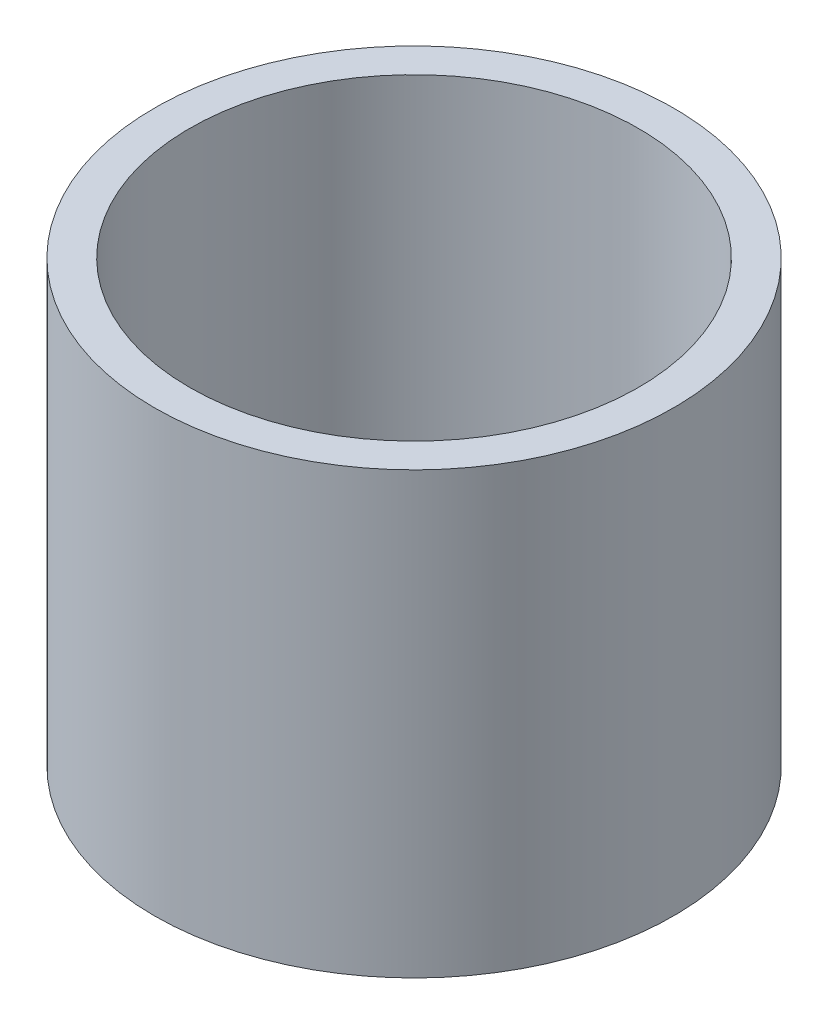
ISO-10303-21;
HEADER;
FILE_DESCRIPTION(('STEP AP214'),'2;1');
FILE_NAME('part.step','',(''),(''),'','','');
FILE_SCHEMA(('AUTOMOTIVE_DESIGN { 1 0 10303 214 1 1 1 1 }'));
ENDSEC;
DATA;
#1=APPLICATION_CONTEXT('core data for automotive mechanical design processes');
#2=APPLICATION_PROTOCOL_DEFINITION('international standard','automotive_design',2000,#1);
#3=PRODUCT_CONTEXT('',#1,'mechanical');
#4=PRODUCT('Part','Part','',(#3));
#5=PRODUCT_RELATED_PRODUCT_CATEGORY('part','',(#4));
#6=PRODUCT_DEFINITION_FORMATION('','',#4);
#7=PRODUCT_DEFINITION_CONTEXT('part definition',#1,'design');
#8=PRODUCT_DEFINITION('design','',#6,#7);
#9=PRODUCT_DEFINITION_SHAPE('','',#8);
#10=(LENGTH_UNIT() NAMED_UNIT(*) SI_UNIT(.MILLI.,.METRE.));
#11=(NAMED_UNIT(*) PLANE_ANGLE_UNIT() SI_UNIT($,.RADIAN.));
#12=(NAMED_UNIT(*) SI_UNIT($,.STERADIAN.) SOLID_ANGLE_UNIT());
#13=UNCERTAINTY_MEASURE_WITH_UNIT(LENGTH_MEASURE(1.E-05),#10,'distance_accuracy_value','');
#14=(GEOMETRIC_REPRESENTATION_CONTEXT(3) GLOBAL_UNCERTAINTY_ASSIGNED_CONTEXT((#13)) GLOBAL_UNIT_ASSIGNED_CONTEXT((#10,
#11,#12)) REPRESENTATION_CONTEXT('',''));
#15=CARTESIAN_POINT('',(0.,0.,0.));
#16=DIRECTION('',(0.,0.,1.));
#17=DIRECTION('',(1.,0.,0.));
#18=AXIS2_PLACEMENT_3D('',#15,#16,#17);
#19=CARTESIAN_POINT('',(0.,10.,0.));
#20=DIRECTION('',(0.,1.,0.));
#21=DIRECTION('',(0.,0.,1.));
#22=AXIS2_PLACEMENT_3D('',#19,#20,#21);
#23=PLANE('',#22);
#24=CARTESIAN_POINT('',(0.,10.,0.));
#25=DIRECTION('',(0.,1.,0.));
#26=DIRECTION('',(0.,0.,1.));
#27=AXIS2_PLACEMENT_3D('',#24,#25,#26);
#28=CIRCLE('',#27,5.9);
#29=CARTESIAN_POINT('',(0.,10.,5.9));
#30=VERTEX_POINT('',#29);
#31=EDGE_CURVE('E10',#30,#30,#28,.T.);
#32=ORIENTED_EDGE('',*,*,#31,.T.);
#33=EDGE_LOOP('',(#32));
#34=FACE_BOUND('',#33,.T.);
#35=CARTESIAN_POINT('',(0.,10.,0.));
#36=DIRECTION('',(0.,1.,0.));
#37=DIRECTION('',(0.,0.,1.));
#38=AXIS2_PLACEMENT_3D('',#35,#36,#37);
#39=CIRCLE('',#38,5.1);
#40=CARTESIAN_POINT('',(0.,10.,5.1));
#41=VERTEX_POINT('',#40);
#42=EDGE_CURVE('E54',#41,#41,#39,.T.);
#43=ORIENTED_EDGE('',*,*,#42,.F.);
#44=EDGE_LOOP('',(#43));
#45=FACE_BOUND('',#44,.T.);
#46=ADVANCED_FACE('F41',(#34,#45),#23,.T.);
#47=CARTESIAN_POINT('',(0.,0.,0.));
#48=DIRECTION('',(0.,1.,0.));
#49=DIRECTION('',(0.,0.,1.));
#50=AXIS2_PLACEMENT_3D('',#47,#48,#49);
#51=PLANE('',#50);
#52=CARTESIAN_POINT('',(0.,0.,0.));
#53=DIRECTION('',(0.,1.,0.));
#54=DIRECTION('',(0.,0.,1.));
#55=AXIS2_PLACEMENT_3D('',#52,#53,#54);
#56=CIRCLE('',#55,5.9);
#57=CARTESIAN_POINT('',(0.,0.,5.9));
#58=VERTEX_POINT('',#57);
#59=EDGE_CURVE('E45',#58,#58,#56,.T.);
#60=ORIENTED_EDGE('',*,*,#59,.F.);
#61=EDGE_LOOP('',(#60));
#62=FACE_BOUND('',#61,.T.);
#63=CARTESIAN_POINT('',(0.,0.,0.));
#64=DIRECTION('',(0.,1.,0.));
#65=DIRECTION('',(0.,0.,1.));
#66=AXIS2_PLACEMENT_3D('',#63,#64,#65);
#67=CIRCLE('',#66,5.1);
#68=CARTESIAN_POINT('',(0.,0.,5.1));
#69=VERTEX_POINT('',#68);
#70=EDGE_CURVE('E56',#69,#69,#67,.T.);
#71=ORIENTED_EDGE('',*,*,#70,.T.);
#72=EDGE_LOOP('',(#71));
#73=FACE_BOUND('',#72,.T.);
#74=ADVANCED_FACE('F68',(#62,#73),#51,.F.);
#75=CARTESIAN_POINT('',(0.,10.,0.));
#76=DIRECTION('',(0.,-1.,0.));
#77=DIRECTION('',(0.,0.,-1.));
#78=AXIS2_PLACEMENT_3D('',#75,#76,#77);
#79=CYLINDRICAL_SURFACE('',#78,5.9);
#80=ORIENTED_EDGE('',*,*,#31,.F.);
#81=EDGE_LOOP('',(#80));
#82=FACE_BOUND('',#81,.T.);
#83=ORIENTED_EDGE('',*,*,#59,.T.);
#84=EDGE_LOOP('',(#83));
#85=FACE_BOUND('',#84,.T.);
#86=ADVANCED_FACE('F43',(#82,#85),#79,.T.);
#87=CARTESIAN_POINT('',(0.,10.,0.));
#88=DIRECTION('',(0.,-1.,0.));
#89=DIRECTION('',(0.,0.,-1.));
#90=AXIS2_PLACEMENT_3D('',#87,#88,#89);
#91=CYLINDRICAL_SURFACE('',#90,5.1);
#92=ORIENTED_EDGE('',*,*,#42,.T.);
#93=EDGE_LOOP('',(#92));
#94=FACE_BOUND('',#93,.T.);
#95=ORIENTED_EDGE('',*,*,#70,.F.);
#96=EDGE_LOOP('',(#95));
#97=FACE_BOUND('',#96,.T.);
#98=ADVANCED_FACE('F64',(#94,#97),#91,.F.);
#99=CLOSED_SHELL('',(#46,#74,#86,#98));
#100=MANIFOLD_SOLID_BREP('B2',#99);
#101=ADVANCED_BREP_SHAPE_REPRESENTATION('',(#18,#100),#14);
#102=SHAPE_DEFINITION_REPRESENTATION(#9,#101);
ENDSEC;
END-ISO-10303-21;
